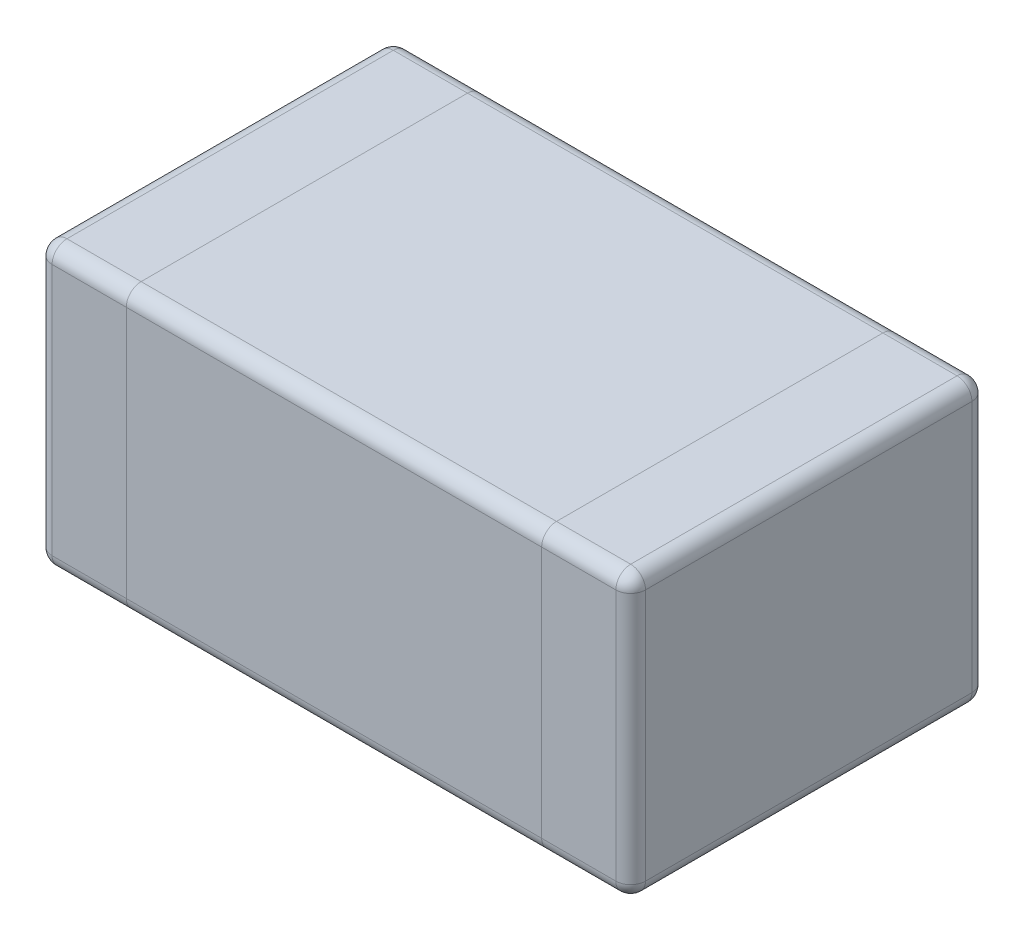
ISO-10303-21;
HEADER;
FILE_DESCRIPTION(('STEP AP214'),'2;1');
FILE_NAME('part.step','',(''),(''),'','','');
FILE_SCHEMA(('AUTOMOTIVE_DESIGN { 1 0 10303 214 1 1 1 1 }'));
ENDSEC;
DATA;
#1=APPLICATION_CONTEXT('core data for automotive mechanical design processes');
#2=APPLICATION_PROTOCOL_DEFINITION('international standard','automotive_design',2000,#1);
#3=PRODUCT_CONTEXT('',#1,'mechanical');
#4=PRODUCT('Part','Part','',(#3));
#5=PRODUCT_RELATED_PRODUCT_CATEGORY('part','',(#4));
#6=PRODUCT_DEFINITION_FORMATION('','',#4);
#7=PRODUCT_DEFINITION_CONTEXT('part definition',#1,'design');
#8=PRODUCT_DEFINITION('design','',#6,#7);
#9=PRODUCT_DEFINITION_SHAPE('','',#8);
#10=(LENGTH_UNIT() NAMED_UNIT(*) SI_UNIT(.MILLI.,.METRE.));
#11=(NAMED_UNIT(*) PLANE_ANGLE_UNIT() SI_UNIT($,.RADIAN.));
#12=(NAMED_UNIT(*) SI_UNIT($,.STERADIAN.) SOLID_ANGLE_UNIT());
#13=UNCERTAINTY_MEASURE_WITH_UNIT(LENGTH_MEASURE(1.E-05),#10,'distance_accuracy_value','');
#14=(GEOMETRIC_REPRESENTATION_CONTEXT(3) GLOBAL_UNCERTAINTY_ASSIGNED_CONTEXT((#13)) GLOBAL_UNIT_ASSIGNED_CONTEXT((#10,
#11,#12)) REPRESENTATION_CONTEXT('',''));
#15=CARTESIAN_POINT('',(0.,0.,0.));
#16=DIRECTION('',(0.,0.,1.));
#17=DIRECTION('',(1.,0.,0.));
#18=AXIS2_PLACEMENT_3D('',#15,#16,#17);
#19=CARTESIAN_POINT('',(1.,0.95,-0.6));
#20=DIRECTION('',(0.,-1.,0.));
#21=DIRECTION('',(0.,0.,-1.));
#22=AXIS2_PLACEMENT_3D('',#19,#20,#21);
#23=PLANE('',#22);
#24=DIRECTION('',(0.,0.,1.));
#25=VECTOR('',#24,1.);
#26=CARTESIAN_POINT('',(-0.7,0.95,-0.6));
#27=LINE('',#26,#25);
#28=CARTESIAN_POINT('',(-0.7,0.95,-0.55));
#29=VERTEX_POINT('',#28);
#30=CARTESIAN_POINT('',(-0.7,0.95,0.55));
#31=VERTEX_POINT('',#30);
#32=EDGE_CURVE('E11',#29,#31,#27,.T.);
#33=ORIENTED_EDGE('',*,*,#32,.F.);
#34=DIRECTION('',(-1.,0.,0.));
#35=VECTOR('',#34,1.);
#36=CARTESIAN_POINT('',(1.,0.95,-0.55));
#37=LINE('',#36,#35);
#38=CARTESIAN_POINT('',(-0.95,0.95,-0.55));
#39=VERTEX_POINT('',#38);
#40=EDGE_CURVE('E255',#29,#39,#37,.T.);
#41=ORIENTED_EDGE('',*,*,#40,.T.);
#42=DIRECTION('',(0.,0.,1.));
#43=VECTOR('',#42,1.);
#44=CARTESIAN_POINT('',(-0.95,0.95,-0.6));
#45=LINE('',#44,#43);
#46=CARTESIAN_POINT('',(-0.95,0.95,0.55));
#47=VERTEX_POINT('',#46);
#48=EDGE_CURVE('E258',#39,#47,#45,.T.);
#49=ORIENTED_EDGE('',*,*,#48,.T.);
#50=DIRECTION('',(1.,0.,0.));
#51=VECTOR('',#50,1.);
#52=CARTESIAN_POINT('',(1.,0.95,0.55));
#53=LINE('',#52,#51);
#54=EDGE_CURVE('E262',#47,#31,#53,.T.);
#55=ORIENTED_EDGE('',*,*,#54,.T.);
#56=EDGE_LOOP('',(#33,#41,#49,#55));
#57=FACE_BOUND('',#56,.T.);
#58=ADVANCED_FACE('F39',(#57),#23,.F.);
#59=DIRECTION('',(0.,0.,-1.));
#60=VECTOR('',#59,1.);
#61=CARTESIAN_POINT('',(0.7,0.95,-0.6));
#62=LINE('',#61,#60);
#63=CARTESIAN_POINT('',(0.7,0.95,0.55));
#64=VERTEX_POINT('',#63);
#65=CARTESIAN_POINT('',(0.7,0.95,-0.55));
#66=VERTEX_POINT('',#65);
#67=EDGE_CURVE('E49',#64,#66,#62,.T.);
#68=ORIENTED_EDGE('',*,*,#67,.F.);
#69=CARTESIAN_POINT('',(0.95,0.95,0.55));
#70=VERTEX_POINT('',#69);
#71=EDGE_CURVE('E261',#64,#70,#53,.T.);
#72=ORIENTED_EDGE('',*,*,#71,.T.);
#73=DIRECTION('',(0.,0.,-1.));
#74=VECTOR('',#73,1.);
#75=CARTESIAN_POINT('',(0.95,0.95,-0.6));
#76=LINE('',#75,#74);
#77=CARTESIAN_POINT('',(0.95,0.95,-0.55));
#78=VERTEX_POINT('',#77);
#79=EDGE_CURVE('E252',#70,#78,#76,.T.);
#80=ORIENTED_EDGE('',*,*,#79,.T.);
#81=EDGE_CURVE('E256',#78,#66,#37,.T.);
#82=ORIENTED_EDGE('',*,*,#81,.T.);
#83=EDGE_LOOP('',(#68,#72,#80,#82));
#84=FACE_BOUND('',#83,.T.);
#85=ADVANCED_FACE('F528',(#84),#23,.F.);
#86=CARTESIAN_POINT('',(1.,0.9,0.55));
#87=DIRECTION('',(1.,0.,0.));
#88=DIRECTION('',(0.,0.,-1.));
#89=AXIS2_PLACEMENT_3D('',#86,#87,#88);
#90=CYLINDRICAL_SURFACE('',#89,0.05);
#91=DIRECTION('',(1.,0.,0.));
#92=VECTOR('',#91,1.);
#93=CARTESIAN_POINT('',(-1.,0.9,0.6));
#94=LINE('',#93,#92);
#95=CARTESIAN_POINT('',(-0.7,0.9,0.6));
#96=VERTEX_POINT('',#95);
#97=CARTESIAN_POINT('',(-0.95,0.9,0.6));
#98=VERTEX_POINT('',#97);
#99=EDGE_CURVE('E248',#96,#98,#94,.F.);
#100=ORIENTED_EDGE('',*,*,#99,.F.);
#101=CARTESIAN_POINT('',(-0.7,0.9,0.55));
#102=DIRECTION('',(1.,0.,0.));
#103=DIRECTION('',(0.,0.,-1.));
#104=AXIS2_PLACEMENT_3D('',#101,#102,#103);
#105=CIRCLE('',#104,0.05);
#106=EDGE_CURVE('E356',#96,#31,#105,.F.);
#107=ORIENTED_EDGE('',*,*,#106,.T.);
#108=ORIENTED_EDGE('',*,*,#54,.F.);
#109=CARTESIAN_POINT('',(-0.95,0.9,0.55));
#110=DIRECTION('',(-1.,0.,0.));
#111=DIRECTION('',(0.,-1.,0.));
#112=AXIS2_PLACEMENT_3D('',#109,#110,#111);
#113=CIRCLE('',#112,0.05);
#114=EDGE_CURVE('E332',#47,#98,#113,.F.);
#115=ORIENTED_EDGE('',*,*,#114,.T.);
#116=EDGE_LOOP('',(#100,#107,#108,#115));
#117=FACE_BOUND('',#116,.T.);
#118=ADVANCED_FACE('F485',(#117),#90,.T.);
#119=ORIENTED_EDGE('',*,*,#71,.F.);
#120=CARTESIAN_POINT('',(0.7,0.9,0.55));
#121=DIRECTION('',(-1.,0.,0.));
#122=DIRECTION('',(0.,0.,1.));
#123=AXIS2_PLACEMENT_3D('',#120,#121,#122);
#124=CIRCLE('',#123,0.05);
#125=CARTESIAN_POINT('',(0.7,0.9,0.6));
#126=VERTEX_POINT('',#125);
#127=EDGE_CURVE('E355',#64,#126,#124,.F.);
#128=ORIENTED_EDGE('',*,*,#127,.T.);
#129=CARTESIAN_POINT('',(0.95,0.9,0.6));
#130=VERTEX_POINT('',#129);
#131=EDGE_CURVE('E249',#130,#126,#94,.F.);
#132=ORIENTED_EDGE('',*,*,#131,.F.);
#133=CARTESIAN_POINT('',(0.95,0.9,0.55));
#134=DIRECTION('',(1.,0.,0.));
#135=DIRECTION('',(0.,0.,-1.));
#136=AXIS2_PLACEMENT_3D('',#133,#134,#135);
#137=CIRCLE('',#136,0.05);
#138=EDGE_CURVE('E317',#70,#130,#137,.T.);
#139=ORIENTED_EDGE('',*,*,#138,.F.);
#140=EDGE_LOOP('',(#119,#128,#132,#139));
#141=FACE_BOUND('',#140,.T.);
#142=ADVANCED_FACE('F459',(#141),#90,.T.);
#143=CARTESIAN_POINT('',(-1.,0.95,0.6));
#144=DIRECTION('',(0.,0.,-1.));
#145=DIRECTION('',(-1.,0.,0.));
#146=AXIS2_PLACEMENT_3D('',#143,#144,#145);
#147=PLANE('',#146);
#148=DIRECTION('',(0.,-1.,0.));
#149=VECTOR('',#148,1.);
#150=CARTESIAN_POINT('',(-0.7,0.95,0.6));
#151=LINE('',#150,#149);
#152=CARTESIAN_POINT('',(-0.7,0.05,0.6));
#153=VERTEX_POINT('',#152);
#154=EDGE_CURVE('E351',#96,#153,#151,.T.);
#155=ORIENTED_EDGE('',*,*,#154,.F.);
#156=ORIENTED_EDGE('',*,*,#99,.T.);
#157=DIRECTION('',(0.,-1.,0.));
#158=VECTOR('',#157,1.);
#159=CARTESIAN_POINT('',(-0.95,0.95,0.6));
#160=LINE('',#159,#158);
#161=CARTESIAN_POINT('',(-0.95,0.05,0.6));
#162=VERTEX_POINT('',#161);
#163=EDGE_CURVE('E245',#98,#162,#160,.T.);
#164=ORIENTED_EDGE('',*,*,#163,.T.);
#165=DIRECTION('',(1.,0.,0.));
#166=VECTOR('',#165,1.);
#167=CARTESIAN_POINT('',(1.,0.05,0.6));
#168=LINE('',#167,#166);
#169=EDGE_CURVE('E239',#162,#153,#168,.T.);
#170=ORIENTED_EDGE('',*,*,#169,.T.);
#171=EDGE_LOOP('',(#155,#156,#164,#170));
#172=FACE_BOUND('',#171,.T.);
#173=ADVANCED_FACE('F473',(#172),#147,.F.);
#174=DIRECTION('',(0.,1.,0.));
#175=VECTOR('',#174,1.);
#176=CARTESIAN_POINT('',(0.7,0.95,0.6));
#177=LINE('',#176,#175);
#178=CARTESIAN_POINT('',(0.7,0.05,0.6));
#179=VERTEX_POINT('',#178);
#180=EDGE_CURVE('E347',#179,#126,#177,.T.);
#181=ORIENTED_EDGE('',*,*,#180,.F.);
#182=CARTESIAN_POINT('',(0.95,0.05,0.6));
#183=VERTEX_POINT('',#182);
#184=EDGE_CURVE('E238',#179,#183,#168,.T.);
#185=ORIENTED_EDGE('',*,*,#184,.T.);
#186=DIRECTION('',(0.,-1.,0.));
#187=VECTOR('',#186,1.);
#188=CARTESIAN_POINT('',(0.95,0.95,0.6));
#189=LINE('',#188,#187);
#190=EDGE_CURVE('E242',#183,#130,#189,.F.);
#191=ORIENTED_EDGE('',*,*,#190,.T.);
#192=ORIENTED_EDGE('',*,*,#131,.T.);
#193=EDGE_LOOP('',(#181,#185,#191,#192));
#194=FACE_BOUND('',#193,.T.);
#195=ADVANCED_FACE('F455',(#194),#147,.F.);
#196=CARTESIAN_POINT('',(-1.,0.05,0.55));
#197=DIRECTION('',(-1.,0.,0.));
#198=DIRECTION('',(0.,0.,1.));
#199=AXIS2_PLACEMENT_3D('',#196,#197,#198);
#200=CYLINDRICAL_SURFACE('',#199,0.05);
#201=DIRECTION('',(1.,0.,0.));
#202=VECTOR('',#201,1.);
#203=CARTESIAN_POINT('',(-1.,0.,0.55));
#204=LINE('',#203,#202);
#205=CARTESIAN_POINT('',(-0.7,0.,0.55));
#206=VERTEX_POINT('',#205);
#207=CARTESIAN_POINT('',(-0.95,0.,0.55));
#208=VERTEX_POINT('',#207);
#209=EDGE_CURVE('E268',#206,#208,#204,.F.);
#210=ORIENTED_EDGE('',*,*,#209,.F.);
#211=CARTESIAN_POINT('',(-0.7,0.05,0.55));
#212=DIRECTION('',(1.,0.,0.));
#213=DIRECTION('',(0.,0.,-1.));
#214=AXIS2_PLACEMENT_3D('',#211,#212,#213);
#215=CIRCLE('',#214,0.05);
#216=EDGE_CURVE('E352',#206,#153,#215,.F.);
#217=ORIENTED_EDGE('',*,*,#216,.T.);
#218=ORIENTED_EDGE('',*,*,#169,.F.);
#219=CARTESIAN_POINT('',(-0.95,0.05,0.55));
#220=DIRECTION('',(-1.,0.,0.));
#221=DIRECTION('',(0.,0.,1.));
#222=AXIS2_PLACEMENT_3D('',#219,#220,#221);
#223=CIRCLE('',#222,0.05);
#224=EDGE_CURVE('E323',#162,#208,#223,.F.);
#225=ORIENTED_EDGE('',*,*,#224,.T.);
#226=EDGE_LOOP('',(#210,#217,#218,#225));
#227=FACE_BOUND('',#226,.T.);
#228=ADVANCED_FACE('F511',(#227),#200,.T.);
#229=ORIENTED_EDGE('',*,*,#184,.F.);
#230=CARTESIAN_POINT('',(0.7,0.05,0.55));
#231=DIRECTION('',(-1.,0.,0.));
#232=DIRECTION('',(0.,0.,1.));
#233=AXIS2_PLACEMENT_3D('',#230,#231,#232);
#234=CIRCLE('',#233,0.05);
#235=CARTESIAN_POINT('',(0.7,0.,0.55));
#236=VERTEX_POINT('',#235);
#237=EDGE_CURVE('E367',#179,#236,#234,.F.);
#238=ORIENTED_EDGE('',*,*,#237,.T.);
#239=CARTESIAN_POINT('',(0.95,0.,0.55));
#240=VERTEX_POINT('',#239);
#241=EDGE_CURVE('E269',#240,#236,#204,.F.);
#242=ORIENTED_EDGE('',*,*,#241,.F.);
#243=CARTESIAN_POINT('',(0.95,0.05,0.55));
#244=DIRECTION('',(1.,0.,0.));
#245=DIRECTION('',(0.,0.,-1.));
#246=AXIS2_PLACEMENT_3D('',#243,#244,#245);
#247=CIRCLE('',#246,0.05);
#248=EDGE_CURVE('E303',#183,#240,#247,.T.);
#249=ORIENTED_EDGE('',*,*,#248,.F.);
#250=EDGE_LOOP('',(#229,#238,#242,#249));
#251=FACE_BOUND('',#250,.T.);
#252=ADVANCED_FACE('F445',(#251),#200,.T.);
#253=CARTESIAN_POINT('',(1.,0.,-0.6));
#254=DIRECTION('',(0.,-1.,0.));
#255=DIRECTION('',(0.,0.,-1.));
#256=AXIS2_PLACEMENT_3D('',#253,#254,#255);
#257=PLANE('',#256);
#258=DIRECTION('',(-1.,0.,0.));
#259=VECTOR('',#258,1.);
#260=CARTESIAN_POINT('',(1.,0.,-0.55));
#261=LINE('',#260,#259);
#262=CARTESIAN_POINT('',(-0.95,0.,-0.55));
#263=VERTEX_POINT('',#262);
#264=CARTESIAN_POINT('',(-0.7,0.,-0.55));
#265=VERTEX_POINT('',#264);
#266=EDGE_CURVE('E276',#263,#265,#261,.F.);
#267=ORIENTED_EDGE('',*,*,#266,.T.);
#268=DIRECTION('',(0.,0.,1.));
#269=VECTOR('',#268,1.);
#270=CARTESIAN_POINT('',(-0.7,0.,-0.6));
#271=LINE('',#270,#269);
#272=EDGE_CURVE('E368',#265,#206,#271,.T.);
#273=ORIENTED_EDGE('',*,*,#272,.T.);
#274=ORIENTED_EDGE('',*,*,#209,.T.);
#275=DIRECTION('',(0.,0.,1.));
#276=VECTOR('',#275,1.);
#277=CARTESIAN_POINT('',(-0.95,0.,-0.6));
#278=LINE('',#277,#276);
#279=EDGE_CURVE('E272',#208,#263,#278,.F.);
#280=ORIENTED_EDGE('',*,*,#279,.T.);
#281=EDGE_LOOP('',(#267,#273,#274,#280));
#282=FACE_BOUND('',#281,.T.);
#283=ADVANCED_FACE('F514',(#282),#257,.T.);
#284=ORIENTED_EDGE('',*,*,#241,.T.);
#285=DIRECTION('',(0.,0.,-1.));
#286=VECTOR('',#285,1.);
#287=CARTESIAN_POINT('',(0.7,0.,-0.6));
#288=LINE('',#287,#286);
#289=CARTESIAN_POINT('',(0.7,0.,-0.55));
#290=VERTEX_POINT('',#289);
#291=EDGE_CURVE('E362',#236,#290,#288,.T.);
#292=ORIENTED_EDGE('',*,*,#291,.T.);
#293=CARTESIAN_POINT('',(0.95,0.,-0.55));
#294=VERTEX_POINT('',#293);
#295=EDGE_CURVE('E275',#290,#294,#261,.F.);
#296=ORIENTED_EDGE('',*,*,#295,.T.);
#297=DIRECTION('',(0.,0.,-1.));
#298=VECTOR('',#297,1.);
#299=CARTESIAN_POINT('',(0.95,0.,0.6));
#300=LINE('',#299,#298);
#301=EDGE_CURVE('E265',#294,#240,#300,.F.);
#302=ORIENTED_EDGE('',*,*,#301,.T.);
#303=EDGE_LOOP('',(#284,#292,#296,#302));
#304=FACE_BOUND('',#303,.T.);
#305=ADVANCED_FACE('F389',(#304),#257,.T.);
#306=CARTESIAN_POINT('',(1.,0.9,-0.55));
#307=DIRECTION('',(-1.,0.,0.));
#308=DIRECTION('',(0.,0.,1.));
#309=AXIS2_PLACEMENT_3D('',#306,#307,#308);
#310=CYLINDRICAL_SURFACE('',#309,0.05);
#311=ORIENTED_EDGE('',*,*,#40,.F.);
#312=CARTESIAN_POINT('',(-0.7,0.9,-0.55));
#313=DIRECTION('',(1.,0.,0.));
#314=DIRECTION('',(0.,0.,-1.));
#315=AXIS2_PLACEMENT_3D('',#312,#313,#314);
#316=CIRCLE('',#315,0.05);
#317=CARTESIAN_POINT('',(-0.7,0.9,-0.6));
#318=VERTEX_POINT('',#317);
#319=EDGE_CURVE('E359',#29,#318,#316,.F.);
#320=ORIENTED_EDGE('',*,*,#319,.T.);
#321=DIRECTION('',(-1.,0.,0.));
#322=VECTOR('',#321,1.);
#323=CARTESIAN_POINT('',(-1.,0.9,-0.6));
#324=LINE('',#323,#322);
#325=CARTESIAN_POINT('',(-0.95,0.9,-0.6));
#326=VERTEX_POINT('',#325);
#327=EDGE_CURVE('E218',#326,#318,#324,.F.);
#328=ORIENTED_EDGE('',*,*,#327,.F.);
#329=CARTESIAN_POINT('',(-0.95,0.9,-0.55));
#330=DIRECTION('',(-1.,0.,0.));
#331=DIRECTION('',(0.,0.,1.));
#332=AXIS2_PLACEMENT_3D('',#329,#330,#331);
#333=CIRCLE('',#332,0.05);
#334=EDGE_CURVE('E294',#326,#39,#333,.F.);
#335=ORIENTED_EDGE('',*,*,#334,.T.);
#336=EDGE_LOOP('',(#311,#320,#328,#335));
#337=FACE_BOUND('',#336,.T.);
#338=ADVANCED_FACE('F521',(#337),#310,.T.);
#339=CARTESIAN_POINT('',(0.7,0.9,-0.6));
#340=VERTEX_POINT('',#339);
#341=CARTESIAN_POINT('',(0.95,0.9,-0.6));
#342=VERTEX_POINT('',#341);
#343=EDGE_CURVE('E213',#340,#342,#324,.F.);
#344=ORIENTED_EDGE('',*,*,#343,.F.);
#345=CARTESIAN_POINT('',(0.7,0.9,-0.55));
#346=DIRECTION('',(-1.,0.,0.));
#347=DIRECTION('',(0.,0.,1.));
#348=AXIS2_PLACEMENT_3D('',#345,#346,#347);
#349=CIRCLE('',#348,0.05);
#350=EDGE_CURVE('E363',#340,#66,#349,.F.);
#351=ORIENTED_EDGE('',*,*,#350,.T.);
#352=ORIENTED_EDGE('',*,*,#81,.F.);
#353=CARTESIAN_POINT('',(0.95,0.9,-0.55));
#354=DIRECTION('',(1.,0.,0.));
#355=DIRECTION('',(0.,1.,0.));
#356=AXIS2_PLACEMENT_3D('',#353,#354,#355);
#357=CIRCLE('',#356,0.05);
#358=EDGE_CURVE('E198',#342,#78,#357,.T.);
#359=ORIENTED_EDGE('',*,*,#358,.F.);
#360=EDGE_LOOP('',(#344,#351,#352,#359));
#361=FACE_BOUND('',#360,.T.);
#362=ADVANCED_FACE('F424',(#361),#310,.T.);
#363=CARTESIAN_POINT('',(-1.,0.05,-0.55));
#364=DIRECTION('',(1.,0.,0.));
#365=DIRECTION('',(0.,0.,-1.));
#366=AXIS2_PLACEMENT_3D('',#363,#364,#365);
#367=CYLINDRICAL_SURFACE('',#366,0.05);
#368=DIRECTION('',(-1.,0.,0.));
#369=VECTOR('',#368,1.);
#370=CARTESIAN_POINT('',(-1.,0.05,-0.6));
#371=LINE('',#370,#369);
#372=CARTESIAN_POINT('',(-0.7,0.05,-0.6));
#373=VERTEX_POINT('',#372);
#374=CARTESIAN_POINT('',(-0.95,0.05,-0.6));
#375=VERTEX_POINT('',#374);
#376=EDGE_CURVE('E210',#373,#375,#371,.T.);
#377=ORIENTED_EDGE('',*,*,#376,.F.);
#378=CARTESIAN_POINT('',(-0.7,0.05,-0.55));
#379=DIRECTION('',(1.,0.,0.));
#380=DIRECTION('',(0.,0.,-1.));
#381=AXIS2_PLACEMENT_3D('',#378,#379,#380);
#382=CIRCLE('',#381,0.05);
#383=EDGE_CURVE('E372',#373,#265,#382,.F.);
#384=ORIENTED_EDGE('',*,*,#383,.T.);
#385=ORIENTED_EDGE('',*,*,#266,.F.);
#386=CARTESIAN_POINT('',(-0.95,0.05,-0.55));
#387=DIRECTION('',(-1.,0.,0.));
#388=DIRECTION('',(0.,0.,1.));
#389=AXIS2_PLACEMENT_3D('',#386,#387,#388);
#390=CIRCLE('',#389,0.05);
#391=EDGE_CURVE('E291',#263,#375,#390,.F.);
#392=ORIENTED_EDGE('',*,*,#391,.T.);
#393=EDGE_LOOP('',(#377,#384,#385,#392));
#394=FACE_BOUND('',#393,.T.);
#395=ADVANCED_FACE('F407',(#394),#367,.T.);
#396=ORIENTED_EDGE('',*,*,#295,.F.);
#397=CARTESIAN_POINT('',(0.7,0.05,-0.55));
#398=DIRECTION('',(-1.,0.,0.));
#399=DIRECTION('',(0.,0.,1.));
#400=AXIS2_PLACEMENT_3D('',#397,#398,#399);
#401=CIRCLE('',#400,0.05);
#402=CARTESIAN_POINT('',(0.7,0.05,-0.6));
#403=VERTEX_POINT('',#402);
#404=EDGE_CURVE('E43',#290,#403,#401,.F.);
#405=ORIENTED_EDGE('',*,*,#404,.T.);
#406=CARTESIAN_POINT('',(0.95,0.05,-0.6));
#407=VERTEX_POINT('',#406);
#408=EDGE_CURVE('E201',#407,#403,#371,.T.);
#409=ORIENTED_EDGE('',*,*,#408,.F.);
#410=CARTESIAN_POINT('',(0.95,0.05,-0.55));
#411=DIRECTION('',(1.,0.,0.));
#412=DIRECTION('',(0.,0.,-1.));
#413=AXIS2_PLACEMENT_3D('',#410,#411,#412);
#414=CIRCLE('',#413,0.05);
#415=EDGE_CURVE('E190',#294,#407,#414,.T.);
#416=ORIENTED_EDGE('',*,*,#415,.F.);
#417=EDGE_LOOP('',(#396,#405,#409,#416));
#418=FACE_BOUND('',#417,.T.);
#419=ADVANCED_FACE('F202',(#418),#367,.T.);
#420=CARTESIAN_POINT('',(-1.,0.95,-0.6));
#421=DIRECTION('',(0.,0.,1.));
#422=DIRECTION('',(1.,0.,0.));
#423=AXIS2_PLACEMENT_3D('',#420,#421,#422);
#424=PLANE('',#423);
#425=DIRECTION('',(0.,1.,0.));
#426=VECTOR('',#425,1.);
#427=CARTESIAN_POINT('',(-0.7,0.95,-0.6));
#428=LINE('',#427,#426);
#429=EDGE_CURVE('E343',#373,#318,#428,.T.);
#430=ORIENTED_EDGE('',*,*,#429,.F.);
#431=ORIENTED_EDGE('',*,*,#376,.T.);
#432=DIRECTION('',(0.,-1.,0.));
#433=VECTOR('',#432,1.);
#434=CARTESIAN_POINT('',(-0.95,0.95,-0.6));
#435=LINE('',#434,#433);
#436=EDGE_CURVE('E207',#375,#326,#435,.F.);
#437=ORIENTED_EDGE('',*,*,#436,.T.);
#438=ORIENTED_EDGE('',*,*,#327,.T.);
#439=EDGE_LOOP('',(#430,#431,#437,#438));
#440=FACE_BOUND('',#439,.T.);
#441=ADVANCED_FACE('F410',(#440),#424,.F.);
#442=DIRECTION('',(0.,-1.,0.));
#443=VECTOR('',#442,1.);
#444=CARTESIAN_POINT('',(0.7,0.95,-0.6));
#445=LINE('',#444,#443);
#446=EDGE_CURVE('E278',#340,#403,#445,.T.);
#447=ORIENTED_EDGE('',*,*,#446,.F.);
#448=ORIENTED_EDGE('',*,*,#343,.T.);
#449=DIRECTION('',(0.,-1.,0.));
#450=VECTOR('',#449,1.);
#451=CARTESIAN_POINT('',(0.95,0.95,-0.6));
#452=LINE('',#451,#450);
#453=EDGE_CURVE('E182',#342,#407,#452,.T.);
#454=ORIENTED_EDGE('',*,*,#453,.T.);
#455=ORIENTED_EDGE('',*,*,#408,.T.);
#456=EDGE_LOOP('',(#447,#448,#454,#455));
#457=FACE_BOUND('',#456,.T.);
#458=ADVANCED_FACE('F211',(#457),#424,.F.);
#459=CARTESIAN_POINT('',(1.,0.95,0.6));
#460=DIRECTION('',(-1.,0.,0.));
#461=DIRECTION('',(0.,0.,1.));
#462=AXIS2_PLACEMENT_3D('',#459,#460,#461);
#463=PLANE('',#462);
#464=DIRECTION('',(0.,-1.,0.));
#465=VECTOR('',#464,1.);
#466=CARTESIAN_POINT('',(1.,0.95,-0.55));
#467=LINE('',#466,#465);
#468=CARTESIAN_POINT('',(1.,0.05,-0.55));
#469=VERTEX_POINT('',#468);
#470=CARTESIAN_POINT('',(1.,0.9,-0.55));
#471=VERTEX_POINT('',#470);
#472=EDGE_CURVE('E184',#469,#471,#467,.F.);
#473=ORIENTED_EDGE('',*,*,#472,.T.);
#474=DIRECTION('',(0.,0.,-1.));
#475=VECTOR('',#474,1.);
#476=CARTESIAN_POINT('',(1.,0.9,0.6));
#477=LINE('',#476,#475);
#478=CARTESIAN_POINT('',(1.,0.9,0.55));
#479=VERTEX_POINT('',#478);
#480=EDGE_CURVE('E227',#471,#479,#477,.F.);
#481=ORIENTED_EDGE('',*,*,#480,.T.);
#482=DIRECTION('',(0.,-1.,0.));
#483=VECTOR('',#482,1.);
#484=CARTESIAN_POINT('',(1.,0.95,0.55));
#485=LINE('',#484,#483);
#486=CARTESIAN_POINT('',(1.,0.05,0.55));
#487=VERTEX_POINT('',#486);
#488=EDGE_CURVE('E224',#479,#487,#485,.T.);
#489=ORIENTED_EDGE('',*,*,#488,.T.);
#490=DIRECTION('',(0.,0.,-1.));
#491=VECTOR('',#490,1.);
#492=CARTESIAN_POINT('',(1.,0.05,-0.6));
#493=LINE('',#492,#491);
#494=EDGE_CURVE('E222',#487,#469,#493,.T.);
#495=ORIENTED_EDGE('',*,*,#494,.T.);
#496=EDGE_LOOP('',(#473,#481,#489,#495));
#497=FACE_BOUND('',#496,.T.);
#498=ADVANCED_FACE('F436',(#497),#463,.F.);
#499=EDGE_CURVE('E208',#403,#373,#371,.T.);
#500=ORIENTED_EDGE('',*,*,#499,.T.);
#501=ORIENTED_EDGE('',*,*,#429,.T.);
#502=EDGE_CURVE('E216',#318,#340,#324,.F.);
#503=ORIENTED_EDGE('',*,*,#502,.T.);
#504=ORIENTED_EDGE('',*,*,#446,.T.);
#505=EDGE_LOOP('',(#500,#501,#503,#504));
#506=FACE_BOUND('',#505,.T.);
#507=ADVANCED_FACE('F416',(#506),#424,.F.);
#508=CARTESIAN_POINT('',(-1.,0.95,0.6));
#509=DIRECTION('',(1.,0.,0.));
#510=DIRECTION('',(0.,0.,-1.));
#511=AXIS2_PLACEMENT_3D('',#508,#509,#510);
#512=PLANE('',#511);
#513=DIRECTION('',(0.,-1.,0.));
#514=VECTOR('',#513,1.);
#515=CARTESIAN_POINT('',(-1.,0.95,0.55));
#516=LINE('',#515,#514);
#517=CARTESIAN_POINT('',(-1.,0.05,0.55));
#518=VERTEX_POINT('',#517);
#519=CARTESIAN_POINT('',(-1.,0.9,0.55));
#520=VERTEX_POINT('',#519);
#521=EDGE_CURVE('E231',#518,#520,#516,.F.);
#522=ORIENTED_EDGE('',*,*,#521,.T.);
#523=DIRECTION('',(0.,0.,1.));
#524=VECTOR('',#523,1.);
#525=CARTESIAN_POINT('',(-1.,0.9,0.6));
#526=LINE('',#525,#524);
#527=CARTESIAN_POINT('',(-1.,0.9,-0.55));
#528=VERTEX_POINT('',#527);
#529=EDGE_CURVE('E236',#520,#528,#526,.F.);
#530=ORIENTED_EDGE('',*,*,#529,.T.);
#531=DIRECTION('',(0.,-1.,0.));
#532=VECTOR('',#531,1.);
#533=CARTESIAN_POINT('',(-1.,0.95,-0.55));
#534=LINE('',#533,#532);
#535=CARTESIAN_POINT('',(-1.,0.05,-0.55));
#536=VERTEX_POINT('',#535);
#537=EDGE_CURVE('E233',#528,#536,#534,.T.);
#538=ORIENTED_EDGE('',*,*,#537,.T.);
#539=DIRECTION('',(0.,0.,1.));
#540=VECTOR('',#539,1.);
#541=CARTESIAN_POINT('',(-1.,0.05,0.6));
#542=LINE('',#541,#540);
#543=EDGE_CURVE('E229',#536,#518,#542,.T.);
#544=ORIENTED_EDGE('',*,*,#543,.T.);
#545=EDGE_LOOP('',(#522,#530,#538,#544));
#546=FACE_BOUND('',#545,.T.);
#547=ADVANCED_FACE('F493',(#546),#512,.F.);
#548=EDGE_CURVE('E253',#126,#96,#94,.F.);
#549=ORIENTED_EDGE('',*,*,#548,.T.);
#550=ORIENTED_EDGE('',*,*,#154,.T.);
#551=EDGE_CURVE('E243',#153,#179,#168,.T.);
#552=ORIENTED_EDGE('',*,*,#551,.T.);
#553=ORIENTED_EDGE('',*,*,#180,.T.);
#554=EDGE_LOOP('',(#549,#550,#552,#553));
#555=FACE_BOUND('',#554,.T.);
#556=ADVANCED_FACE('F466',(#555),#147,.F.);
#557=EDGE_CURVE('E259',#66,#29,#37,.T.);
#558=ORIENTED_EDGE('',*,*,#557,.T.);
#559=ORIENTED_EDGE('',*,*,#32,.T.);
#560=EDGE_CURVE('E266',#31,#64,#53,.T.);
#561=ORIENTED_EDGE('',*,*,#560,.T.);
#562=ORIENTED_EDGE('',*,*,#67,.T.);
#563=EDGE_LOOP('',(#558,#559,#561,#562));
#564=FACE_BOUND('',#563,.T.);
#565=ADVANCED_FACE('F526',(#564),#23,.F.);
#566=ORIENTED_EDGE('',*,*,#272,.F.);
#567=EDGE_CURVE('E279',#265,#290,#261,.F.);
#568=ORIENTED_EDGE('',*,*,#567,.T.);
#569=ORIENTED_EDGE('',*,*,#291,.F.);
#570=EDGE_CURVE('E273',#236,#206,#204,.F.);
#571=ORIENTED_EDGE('',*,*,#570,.T.);
#572=EDGE_LOOP('',(#566,#568,#569,#571));
#573=FACE_BOUND('',#572,.T.);
#574=ADVANCED_FACE('F401',(#573),#257,.T.);
#575=CARTESIAN_POINT('',(-0.95,0.95,0.55));
#576=DIRECTION('',(0.,-1.,0.));
#577=DIRECTION('',(0.,0.,-1.));
#578=AXIS2_PLACEMENT_3D('',#575,#576,#577);
#579=CYLINDRICAL_SURFACE('',#578,0.05);
#580=CARTESIAN_POINT('',(-0.95,0.9,0.55));
#581=DIRECTION('',(0.,1.,0.));
#582=DIRECTION('',(0.,0.,1.));
#583=AXIS2_PLACEMENT_3D('',#580,#581,#582);
#584=CIRCLE('',#583,0.05);
#585=EDGE_CURVE('E338',#520,#98,#584,.T.);
#586=ORIENTED_EDGE('',*,*,#585,.F.);
#587=ORIENTED_EDGE('',*,*,#521,.F.);
#588=CARTESIAN_POINT('',(-0.95,0.05,0.55));
#589=DIRECTION('',(0.,-1.,0.));
#590=DIRECTION('',(0.,0.,-1.));
#591=AXIS2_PLACEMENT_3D('',#588,#589,#590);
#592=CIRCLE('',#591,0.05);
#593=EDGE_CURVE('E335',#162,#518,#592,.T.);
#594=ORIENTED_EDGE('',*,*,#593,.F.);
#595=ORIENTED_EDGE('',*,*,#163,.F.);
#596=EDGE_LOOP('',(#586,#587,#594,#595));
#597=FACE_BOUND('',#596,.T.);
#598=ADVANCED_FACE('F41',(#597),#579,.T.);
#599=CARTESIAN_POINT('',(-0.95,0.9,0.55));
#600=DIRECTION('',(0.,0.,1.));
#601=DIRECTION('',(1.,0.,0.));
#602=AXIS2_PLACEMENT_3D('',#599,#600,#601);
#603=SPHERICAL_SURFACE('',#602,0.05);
#604=CARTESIAN_POINT('',(-0.95,0.9,0.55));
#605=DIRECTION('',(0.,0.,1.));
#606=DIRECTION('',(1.,0.,0.));
#607=AXIS2_PLACEMENT_3D('',#604,#605,#606);
#608=CIRCLE('',#607,0.05);
#609=EDGE_CURVE('E329',#520,#47,#608,.F.);
#610=ORIENTED_EDGE('',*,*,#609,.F.);
#611=ORIENTED_EDGE('',*,*,#585,.T.);
#612=ORIENTED_EDGE('',*,*,#114,.F.);
#613=EDGE_LOOP('',(#610,#611,#612));
#614=FACE_BOUND('',#613,.T.);
#615=ADVANCED_FACE('F482',(#614),#603,.T.);
#616=CARTESIAN_POINT('',(-0.95,0.05,0.55));
#617=DIRECTION('',(0.,0.,1.));
#618=DIRECTION('',(1.,0.,0.));
#619=AXIS2_PLACEMENT_3D('',#616,#617,#618);
#620=SPHERICAL_SURFACE('',#619,0.05);
#621=ORIENTED_EDGE('',*,*,#224,.F.);
#622=ORIENTED_EDGE('',*,*,#593,.T.);
#623=CARTESIAN_POINT('',(-0.95,0.05,0.55));
#624=DIRECTION('',(0.,0.,1.));
#625=DIRECTION('',(1.,0.,0.));
#626=AXIS2_PLACEMENT_3D('',#623,#624,#625);
#627=CIRCLE('',#626,0.05);
#628=EDGE_CURVE('E326',#208,#518,#627,.F.);
#629=ORIENTED_EDGE('',*,*,#628,.F.);
#630=EDGE_LOOP('',(#621,#622,#629));
#631=FACE_BOUND('',#630,.T.);
#632=ADVANCED_FACE('F509',(#631),#620,.T.);
#633=ORIENTED_EDGE('',*,*,#106,.F.);
#634=ORIENTED_EDGE('',*,*,#548,.F.);
#635=ORIENTED_EDGE('',*,*,#127,.F.);
#636=ORIENTED_EDGE('',*,*,#560,.F.);
#637=EDGE_LOOP('',(#633,#634,#635,#636));
#638=FACE_BOUND('',#637,.T.);
#639=ADVANCED_FACE('F468',(#638),#90,.T.);
#640=CARTESIAN_POINT('',(-0.95,0.9,-0.6));
#641=DIRECTION('',(0.,0.,1.));
#642=DIRECTION('',(1.,0.,0.));
#643=AXIS2_PLACEMENT_3D('',#640,#641,#642);
#644=CYLINDRICAL_SURFACE('',#643,0.05);
#645=ORIENTED_EDGE('',*,*,#609,.T.);
#646=ORIENTED_EDGE('',*,*,#48,.F.);
#647=CARTESIAN_POINT('',(-0.95,0.9,-0.55));
#648=DIRECTION('',(0.,0.,-1.));
#649=DIRECTION('',(0.,1.,0.));
#650=AXIS2_PLACEMENT_3D('',#647,#648,#649);
#651=CIRCLE('',#650,0.05);
#652=EDGE_CURVE('E314',#528,#39,#651,.T.);
#653=ORIENTED_EDGE('',*,*,#652,.F.);
#654=ORIENTED_EDGE('',*,*,#529,.F.);
#655=EDGE_LOOP('',(#645,#646,#653,#654));
#656=FACE_BOUND('',#655,.T.);
#657=ADVANCED_FACE('F490',(#656),#644,.T.);
#658=CARTESIAN_POINT('',(-0.95,0.95,-0.55));
#659=DIRECTION('',(0.,-1.,0.));
#660=DIRECTION('',(0.,0.,-1.));
#661=AXIS2_PLACEMENT_3D('',#658,#659,#660);
#662=CYLINDRICAL_SURFACE('',#661,0.05);
#663=CARTESIAN_POINT('',(-0.95,0.05,-0.55));
#664=DIRECTION('',(0.,-1.,0.));
#665=DIRECTION('',(0.,0.,-1.));
#666=AXIS2_PLACEMENT_3D('',#663,#664,#665);
#667=CIRCLE('',#666,0.05);
#668=EDGE_CURVE('E308',#536,#375,#667,.T.);
#669=ORIENTED_EDGE('',*,*,#668,.F.);
#670=ORIENTED_EDGE('',*,*,#537,.F.);
#671=CARTESIAN_POINT('',(-0.95,0.9,-0.55));
#672=DIRECTION('',(0.,1.,0.));
#673=DIRECTION('',(0.,0.,1.));
#674=AXIS2_PLACEMENT_3D('',#671,#672,#673);
#675=CIRCLE('',#674,0.05);
#676=EDGE_CURVE('E311',#326,#528,#675,.T.);
#677=ORIENTED_EDGE('',*,*,#676,.F.);
#678=ORIENTED_EDGE('',*,*,#436,.F.);
#679=EDGE_LOOP('',(#669,#670,#677,#678));
#680=FACE_BOUND('',#679,.T.);
#681=ADVANCED_FACE('F497',(#680),#662,.T.);
#682=CARTESIAN_POINT('',(-0.95,0.05,0.6));
#683=DIRECTION('',(0.,0.,-1.));
#684=DIRECTION('',(-1.,0.,0.));
#685=AXIS2_PLACEMENT_3D('',#682,#683,#684);
#686=CYLINDRICAL_SURFACE('',#685,0.05);
#687=ORIENTED_EDGE('',*,*,#628,.T.);
#688=ORIENTED_EDGE('',*,*,#543,.F.);
#689=CARTESIAN_POINT('',(-0.95,0.05,-0.55));
#690=DIRECTION('',(0.,0.,-1.));
#691=DIRECTION('',(-1.,0.,0.));
#692=AXIS2_PLACEMENT_3D('',#689,#690,#691);
#693=CIRCLE('',#692,0.05);
#694=EDGE_CURVE('E306',#263,#536,#693,.T.);
#695=ORIENTED_EDGE('',*,*,#694,.F.);
#696=ORIENTED_EDGE('',*,*,#279,.F.);
#697=EDGE_LOOP('',(#687,#688,#695,#696));
#698=FACE_BOUND('',#697,.T.);
#699=ADVANCED_FACE('F504',(#698),#686,.T.);
#700=ORIENTED_EDGE('',*,*,#216,.F.);
#701=ORIENTED_EDGE('',*,*,#570,.F.);
#702=ORIENTED_EDGE('',*,*,#237,.F.);
#703=ORIENTED_EDGE('',*,*,#551,.F.);
#704=EDGE_LOOP('',(#700,#701,#702,#703));
#705=FACE_BOUND('',#704,.T.);
#706=ADVANCED_FACE('F513',(#705),#200,.T.);
#707=CARTESIAN_POINT('',(0.95,0.95,0.55));
#708=DIRECTION('',(0.,-1.,0.));
#709=DIRECTION('',(0.,0.,-1.));
#710=AXIS2_PLACEMENT_3D('',#707,#708,#709);
#711=CYLINDRICAL_SURFACE('',#710,0.05);
#712=CARTESIAN_POINT('',(0.95,0.9,0.55));
#713=DIRECTION('',(0.,1.,0.));
#714=DIRECTION('',(0.,0.,1.));
#715=AXIS2_PLACEMENT_3D('',#712,#713,#714);
#716=CIRCLE('',#715,0.05);
#717=EDGE_CURVE('E320',#130,#479,#716,.T.);
#718=ORIENTED_EDGE('',*,*,#717,.F.);
#719=ORIENTED_EDGE('',*,*,#190,.F.);
#720=CARTESIAN_POINT('',(0.95,0.05,0.55));
#721=DIRECTION('',(0.,-1.,0.));
#722=DIRECTION('',(0.,0.,-1.));
#723=AXIS2_PLACEMENT_3D('',#720,#721,#722);
#724=CIRCLE('',#723,0.05);
#725=EDGE_CURVE('E300',#487,#183,#724,.T.);
#726=ORIENTED_EDGE('',*,*,#725,.F.);
#727=ORIENTED_EDGE('',*,*,#488,.F.);
#728=EDGE_LOOP('',(#718,#719,#726,#727));
#729=FACE_BOUND('',#728,.T.);
#730=ADVANCED_FACE('F452',(#729),#711,.T.);
#731=CARTESIAN_POINT('',(0.95,0.9,0.55));
#732=DIRECTION('',(0.,0.,1.));
#733=DIRECTION('',(1.,0.,0.));
#734=AXIS2_PLACEMENT_3D('',#731,#732,#733);
#735=SPHERICAL_SURFACE('',#734,0.05);
#736=ORIENTED_EDGE('',*,*,#138,.T.);
#737=ORIENTED_EDGE('',*,*,#717,.T.);
#738=CARTESIAN_POINT('',(0.95,0.9,0.55));
#739=DIRECTION('',(0.,0.,1.));
#740=DIRECTION('',(0.,-1.,0.));
#741=AXIS2_PLACEMENT_3D('',#738,#739,#740);
#742=CIRCLE('',#741,0.05);
#743=EDGE_CURVE('E297',#70,#479,#742,.F.);
#744=ORIENTED_EDGE('',*,*,#743,.F.);
#745=EDGE_LOOP('',(#736,#737,#744));
#746=FACE_BOUND('',#745,.T.);
#747=ADVANCED_FACE('F537',(#746),#735,.T.);
#748=CARTESIAN_POINT('',(-0.95,0.9,-0.55));
#749=DIRECTION('',(0.,0.,1.));
#750=DIRECTION('',(1.,0.,0.));
#751=AXIS2_PLACEMENT_3D('',#748,#749,#750);
#752=SPHERICAL_SURFACE('',#751,0.05);
#753=ORIENTED_EDGE('',*,*,#676,.T.);
#754=ORIENTED_EDGE('',*,*,#652,.T.);
#755=ORIENTED_EDGE('',*,*,#334,.F.);
#756=EDGE_LOOP('',(#753,#754,#755));
#757=FACE_BOUND('',#756,.T.);
#758=ADVANCED_FACE('F539',(#757),#752,.T.);
#759=CARTESIAN_POINT('',(-0.95,0.05,-0.55));
#760=DIRECTION('',(0.,0.,1.));
#761=DIRECTION('',(1.,0.,0.));
#762=AXIS2_PLACEMENT_3D('',#759,#760,#761);
#763=SPHERICAL_SURFACE('',#762,0.05);
#764=ORIENTED_EDGE('',*,*,#694,.T.);
#765=ORIENTED_EDGE('',*,*,#668,.T.);
#766=ORIENTED_EDGE('',*,*,#391,.F.);
#767=EDGE_LOOP('',(#764,#765,#766));
#768=FACE_BOUND('',#767,.T.);
#769=ADVANCED_FACE('F545',(#768),#763,.T.);
#770=CARTESIAN_POINT('',(0.95,0.05,0.55));
#771=DIRECTION('',(0.,0.,1.));
#772=DIRECTION('',(1.,0.,0.));
#773=AXIS2_PLACEMENT_3D('',#770,#771,#772);
#774=SPHERICAL_SURFACE('',#773,0.05);
#775=ORIENTED_EDGE('',*,*,#725,.T.);
#776=ORIENTED_EDGE('',*,*,#248,.T.);
#777=CARTESIAN_POINT('',(0.95,0.05,0.55));
#778=DIRECTION('',(0.,0.,1.));
#779=DIRECTION('',(1.,0.,0.));
#780=AXIS2_PLACEMENT_3D('',#777,#778,#779);
#781=CIRCLE('',#780,0.05);
#782=EDGE_CURVE('E288',#487,#240,#781,.F.);
#783=ORIENTED_EDGE('',*,*,#782,.F.);
#784=EDGE_LOOP('',(#775,#776,#783));
#785=FACE_BOUND('',#784,.T.);
#786=ADVANCED_FACE('F448',(#785),#774,.T.);
#787=CARTESIAN_POINT('',(0.95,0.9,-0.6));
#788=DIRECTION('',(0.,0.,-1.));
#789=DIRECTION('',(-1.,0.,0.));
#790=AXIS2_PLACEMENT_3D('',#787,#788,#789);
#791=CYLINDRICAL_SURFACE('',#790,0.05);
#792=ORIENTED_EDGE('',*,*,#743,.T.);
#793=ORIENTED_EDGE('',*,*,#480,.F.);
#794=CARTESIAN_POINT('',(0.95,0.9,-0.55));
#795=DIRECTION('',(0.,0.,-1.));
#796=DIRECTION('',(-1.,0.,0.));
#797=AXIS2_PLACEMENT_3D('',#794,#795,#796);
#798=CIRCLE('',#797,0.05);
#799=EDGE_CURVE('E285',#78,#471,#798,.T.);
#800=ORIENTED_EDGE('',*,*,#799,.F.);
#801=ORIENTED_EDGE('',*,*,#79,.F.);
#802=EDGE_LOOP('',(#792,#793,#800,#801));
#803=FACE_BOUND('',#802,.T.);
#804=ADVANCED_FACE('F432',(#803),#791,.T.);
#805=ORIENTED_EDGE('',*,*,#319,.F.);
#806=ORIENTED_EDGE('',*,*,#557,.F.);
#807=ORIENTED_EDGE('',*,*,#350,.F.);
#808=ORIENTED_EDGE('',*,*,#502,.F.);
#809=EDGE_LOOP('',(#805,#806,#807,#808));
#810=FACE_BOUND('',#809,.T.);
#811=ADVANCED_FACE('F419',(#810),#310,.T.);
#812=ORIENTED_EDGE('',*,*,#383,.F.);
#813=ORIENTED_EDGE('',*,*,#499,.F.);
#814=ORIENTED_EDGE('',*,*,#404,.F.);
#815=ORIENTED_EDGE('',*,*,#567,.F.);
#816=EDGE_LOOP('',(#812,#813,#814,#815));
#817=FACE_BOUND('',#816,.T.);
#818=ADVANCED_FACE('F398',(#817),#367,.T.);
#819=CARTESIAN_POINT('',(0.95,0.05,0.6));
#820=DIRECTION('',(0.,0.,1.));
#821=DIRECTION('',(1.,0.,0.));
#822=AXIS2_PLACEMENT_3D('',#819,#820,#821);
#823=CYLINDRICAL_SURFACE('',#822,0.05);
#824=ORIENTED_EDGE('',*,*,#782,.T.);
#825=ORIENTED_EDGE('',*,*,#301,.F.);
#826=CARTESIAN_POINT('',(0.95,0.05,-0.55));
#827=DIRECTION('',(0.,0.,-1.));
#828=DIRECTION('',(-1.,0.,0.));
#829=AXIS2_PLACEMENT_3D('',#826,#827,#828);
#830=CIRCLE('',#829,0.05);
#831=EDGE_CURVE('E194',#469,#294,#830,.T.);
#832=ORIENTED_EDGE('',*,*,#831,.F.);
#833=ORIENTED_EDGE('',*,*,#494,.F.);
#834=EDGE_LOOP('',(#824,#825,#832,#833));
#835=FACE_BOUND('',#834,.T.);
#836=ADVANCED_FACE('F440',(#835),#823,.T.);
#837=CARTESIAN_POINT('',(0.95,0.9,-0.55));
#838=DIRECTION('',(0.,0.,1.));
#839=DIRECTION('',(1.,0.,0.));
#840=AXIS2_PLACEMENT_3D('',#837,#838,#839);
#841=SPHERICAL_SURFACE('',#840,0.05);
#842=ORIENTED_EDGE('',*,*,#358,.T.);
#843=ORIENTED_EDGE('',*,*,#799,.T.);
#844=CARTESIAN_POINT('',(0.95,0.9,-0.55));
#845=DIRECTION('',(0.,1.,0.));
#846=DIRECTION('',(0.,0.,1.));
#847=AXIS2_PLACEMENT_3D('',#844,#845,#846);
#848=CIRCLE('',#847,0.05);
#849=EDGE_CURVE('E187',#342,#471,#848,.F.);
#850=ORIENTED_EDGE('',*,*,#849,.F.);
#851=EDGE_LOOP('',(#842,#843,#850));
#852=FACE_BOUND('',#851,.T.);
#853=ADVANCED_FACE('F428',(#852),#841,.T.);
#854=CARTESIAN_POINT('',(0.95,0.05,-0.55));
#855=DIRECTION('',(0.,0.,1.));
#856=DIRECTION('',(1.,0.,0.));
#857=AXIS2_PLACEMENT_3D('',#854,#855,#856);
#858=SPHERICAL_SURFACE('',#857,0.05);
#859=ORIENTED_EDGE('',*,*,#831,.T.);
#860=ORIENTED_EDGE('',*,*,#415,.T.);
#861=CARTESIAN_POINT('',(0.95,0.05,-0.55));
#862=DIRECTION('',(0.,-1.,0.));
#863=DIRECTION('',(0.,0.,-1.));
#864=AXIS2_PLACEMENT_3D('',#861,#862,#863);
#865=CIRCLE('',#864,0.05);
#866=EDGE_CURVE('E178',#469,#407,#865,.F.);
#867=ORIENTED_EDGE('',*,*,#866,.F.);
#868=EDGE_LOOP('',(#859,#860,#867));
#869=FACE_BOUND('',#868,.T.);
#870=ADVANCED_FACE('F192',(#869),#858,.T.);
#871=CARTESIAN_POINT('',(0.95,0.95,-0.55));
#872=DIRECTION('',(0.,-1.,0.));
#873=DIRECTION('',(0.,0.,-1.));
#874=AXIS2_PLACEMENT_3D('',#871,#872,#873);
#875=CYLINDRICAL_SURFACE('',#874,0.05);
#876=ORIENTED_EDGE('',*,*,#849,.T.);
#877=ORIENTED_EDGE('',*,*,#472,.F.);
#878=ORIENTED_EDGE('',*,*,#866,.T.);
#879=ORIENTED_EDGE('',*,*,#453,.F.);
#880=EDGE_LOOP('',(#876,#877,#878,#879));
#881=FACE_BOUND('',#880,.T.);
#882=ADVANCED_FACE('F180',(#881),#875,.T.);
#883=CLOSED_SHELL('',(#58,#85,#118,#142,#173,#195,#228,#252,#283,#305,#338,#362,#395,#419,#441,
#458,#498,#507,#547,#556,#565,#574,#598,#615,#632,#639,#657,#681,#699,#706,#730,#747,#758,#769,
#786,#804,#811,#818,#836,#853,#870,#882));
#884=MANIFOLD_SOLID_BREP('B2',#883);
#885=ADVANCED_BREP_SHAPE_REPRESENTATION('',(#18,#884),#14);
#886=SHAPE_DEFINITION_REPRESENTATION(#9,#885);
ENDSEC;
END-ISO-10303-21;
